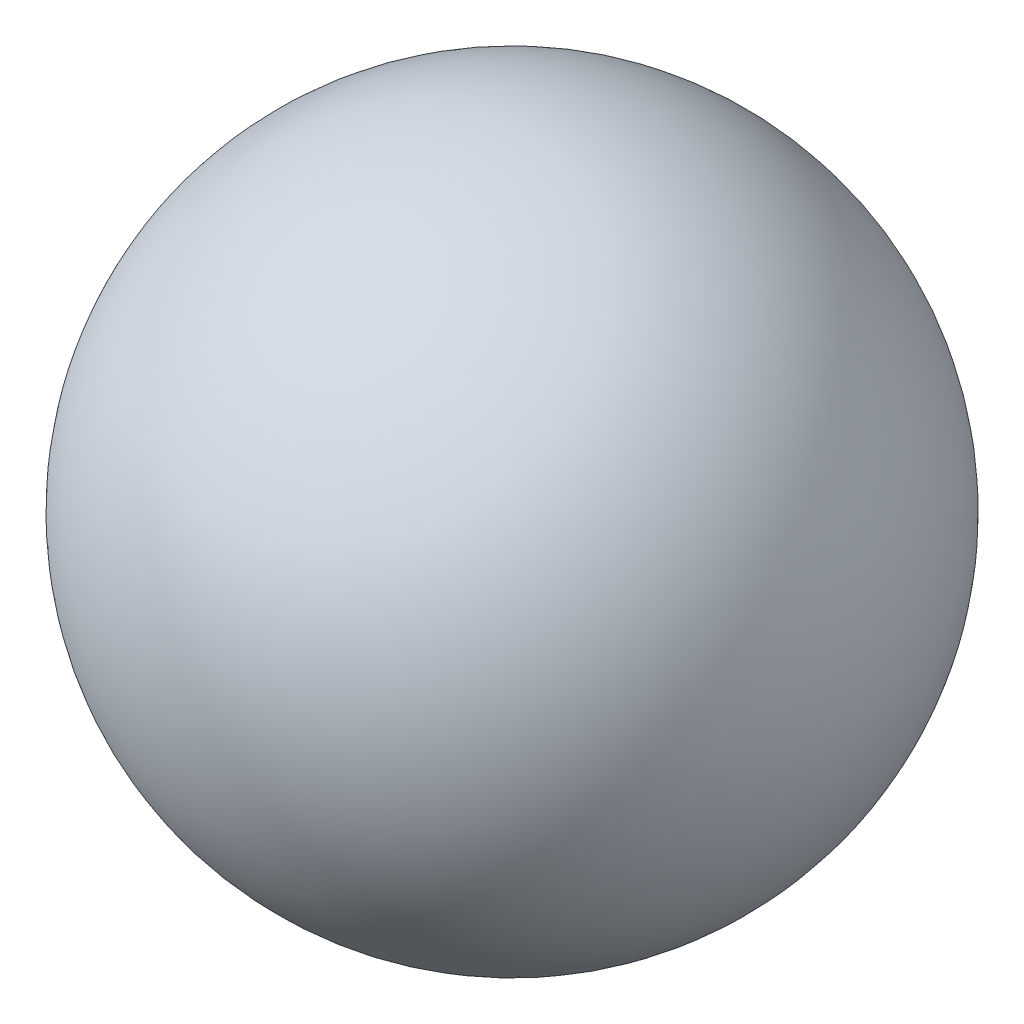
ISO-10303-21;
HEADER;
FILE_DESCRIPTION(('STEP AP214'),'2;1');
FILE_NAME('part.step','',(''),(''),'','','');
FILE_SCHEMA(('AUTOMOTIVE_DESIGN { 1 0 10303 214 1 1 1 1 }'));
ENDSEC;
DATA;
#1=APPLICATION_CONTEXT('core data for automotive mechanical design processes');
#2=APPLICATION_PROTOCOL_DEFINITION('international standard','automotive_design',2000,#1);
#3=PRODUCT_CONTEXT('',#1,'mechanical');
#4=PRODUCT('Part','Part','',(#3));
#5=PRODUCT_RELATED_PRODUCT_CATEGORY('part','',(#4));
#6=PRODUCT_DEFINITION_FORMATION('','',#4);
#7=PRODUCT_DEFINITION_CONTEXT('part definition',#1,'design');
#8=PRODUCT_DEFINITION('design','',#6,#7);
#9=PRODUCT_DEFINITION_SHAPE('','',#8);
#10=(LENGTH_UNIT() NAMED_UNIT(*) SI_UNIT(.MILLI.,.METRE.));
#11=(NAMED_UNIT(*) PLANE_ANGLE_UNIT() SI_UNIT($,.RADIAN.));
#12=(NAMED_UNIT(*) SI_UNIT($,.STERADIAN.) SOLID_ANGLE_UNIT());
#13=UNCERTAINTY_MEASURE_WITH_UNIT(LENGTH_MEASURE(1.E-05),#10,'distance_accuracy_value','');
#14=(GEOMETRIC_REPRESENTATION_CONTEXT(3) GLOBAL_UNCERTAINTY_ASSIGNED_CONTEXT((#13)) GLOBAL_UNIT_ASSIGNED_CONTEXT((#10,
#11,#12)) REPRESENTATION_CONTEXT('',''));
#15=CARTESIAN_POINT('',(0.,0.,0.));
#16=DIRECTION('',(0.,0.,1.));
#17=DIRECTION('',(1.,0.,0.));
#18=AXIS2_PLACEMENT_3D('',#15,#16,#17);
#19=CARTESIAN_POINT('',(0.,0.,0.));
#20=DIRECTION('',(1.,0.,0.));
#21=DIRECTION('',(0.,-1.,0.));
#22=AXIS2_PLACEMENT_3D('',#19,#20,#21);
#23=SPHERICAL_SURFACE('',#22,0.7);
#24=CARTESIAN_POINT('',(0.7,0.,0.));
#25=VERTEX_POINT('',#24);
#26=VERTEX_LOOP('',#25);
#27=FACE_BOUND('',#26,.T.);
#28=ADVANCED_FACE('F30',(#27),#23,.T.);
#29=CLOSED_SHELL('',(#28));
#30=MANIFOLD_SOLID_BREP('B2',#29);
#31=ADVANCED_BREP_SHAPE_REPRESENTATION('',(#18,#30),#14);
#32=SHAPE_DEFINITION_REPRESENTATION(#9,#31);
ENDSEC;
END-ISO-10303-21;
